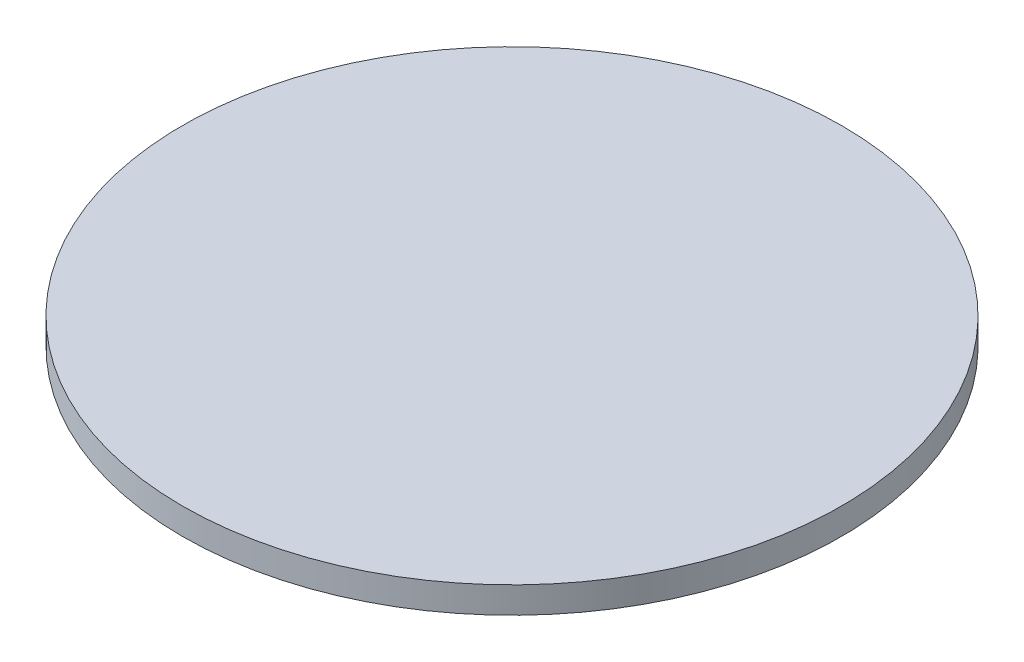
ISO-10303-21;
HEADER;
FILE_DESCRIPTION(('STEP AP214'),'2;1');
FILE_NAME('part.step','',(''),(''),'','','');
FILE_SCHEMA(('AUTOMOTIVE_DESIGN { 1 0 10303 214 1 1 1 1 }'));
ENDSEC;
DATA;
#1=APPLICATION_CONTEXT('core data for automotive mechanical design processes');
#2=APPLICATION_PROTOCOL_DEFINITION('international standard','automotive_design',2000,#1);
#3=PRODUCT_CONTEXT('',#1,'mechanical');
#4=PRODUCT('Part','Part','',(#3));
#5=PRODUCT_RELATED_PRODUCT_CATEGORY('part','',(#4));
#6=PRODUCT_DEFINITION_FORMATION('','',#4);
#7=PRODUCT_DEFINITION_CONTEXT('part definition',#1,'design');
#8=PRODUCT_DEFINITION('design','',#6,#7);
#9=PRODUCT_DEFINITION_SHAPE('','',#8);
#10=(LENGTH_UNIT() NAMED_UNIT(*) SI_UNIT(.MILLI.,.METRE.));
#11=(NAMED_UNIT(*) PLANE_ANGLE_UNIT() SI_UNIT($,.RADIAN.));
#12=(NAMED_UNIT(*) SI_UNIT($,.STERADIAN.) SOLID_ANGLE_UNIT());
#13=UNCERTAINTY_MEASURE_WITH_UNIT(LENGTH_MEASURE(1.E-05),#10,'distance_accuracy_value','');
#14=(GEOMETRIC_REPRESENTATION_CONTEXT(3) GLOBAL_UNCERTAINTY_ASSIGNED_CONTEXT((#13)) GLOBAL_UNIT_ASSIGNED_CONTEXT((#10,
#11,#12)) REPRESENTATION_CONTEXT('',''));
#15=CARTESIAN_POINT('',(0.,0.,0.));
#16=DIRECTION('',(0.,0.,1.));
#17=DIRECTION('',(1.,0.,0.));
#18=AXIS2_PLACEMENT_3D('',#15,#16,#17);
#19=CARTESIAN_POINT('',(0.,0.4,0.));
#20=DIRECTION('',(0.,-1.,0.));
#21=DIRECTION('',(0.,0.,-1.));
#22=AXIS2_PLACEMENT_3D('',#19,#20,#21);
#23=CYLINDRICAL_SURFACE('',#22,5.);
#24=CARTESIAN_POINT('',(0.,0.4,0.));
#25=DIRECTION('',(0.,1.,0.));
#26=DIRECTION('',(0.,0.,1.));
#27=AXIS2_PLACEMENT_3D('',#24,#25,#26);
#28=CIRCLE('',#27,5.);
#29=CARTESIAN_POINT('',(0.,0.4,5.));
#30=VERTEX_POINT('',#29);
#31=EDGE_CURVE('E10',#30,#30,#28,.T.);
#32=ORIENTED_EDGE('',*,*,#31,.F.);
#33=EDGE_LOOP('',(#32));
#34=FACE_BOUND('',#33,.T.);
#35=CARTESIAN_POINT('',(0.,0.,0.));
#36=DIRECTION('',(0.,1.,0.));
#37=DIRECTION('',(0.,0.,1.));
#38=AXIS2_PLACEMENT_3D('',#35,#36,#37);
#39=CIRCLE('',#38,5.);
#40=CARTESIAN_POINT('',(0.,0.,5.));
#41=VERTEX_POINT('',#40);
#42=EDGE_CURVE('E34',#41,#41,#39,.T.);
#43=ORIENTED_EDGE('',*,*,#42,.T.);
#44=EDGE_LOOP('',(#43));
#45=FACE_BOUND('',#44,.T.);
#46=ADVANCED_FACE('F31',(#34,#45),#23,.T.);
#47=CARTESIAN_POINT('',(0.,0.4,0.));
#48=DIRECTION('',(0.,1.,0.));
#49=DIRECTION('',(0.,0.,1.));
#50=AXIS2_PLACEMENT_3D('',#47,#48,#49);
#51=PLANE('',#50);
#52=ORIENTED_EDGE('',*,*,#31,.T.);
#53=EDGE_LOOP('',(#52));
#54=FACE_BOUND('',#53,.T.);
#55=ADVANCED_FACE('F46',(#54),#51,.T.);
#56=CARTESIAN_POINT('',(0.,0.,0.));
#57=DIRECTION('',(0.,1.,0.));
#58=DIRECTION('',(0.,0.,1.));
#59=AXIS2_PLACEMENT_3D('',#56,#57,#58);
#60=PLANE('',#59);
#61=ORIENTED_EDGE('',*,*,#42,.F.);
#62=EDGE_LOOP('',(#61));
#63=FACE_BOUND('',#62,.T.);
#64=ADVANCED_FACE('F44',(#63),#60,.F.);
#65=CLOSED_SHELL('',(#46,#55,#64));
#66=MANIFOLD_SOLID_BREP('B2',#65);
#67=ADVANCED_BREP_SHAPE_REPRESENTATION('',(#18,#66),#14);
#68=SHAPE_DEFINITION_REPRESENTATION(#9,#67);
ENDSEC;
END-ISO-10303-21;
